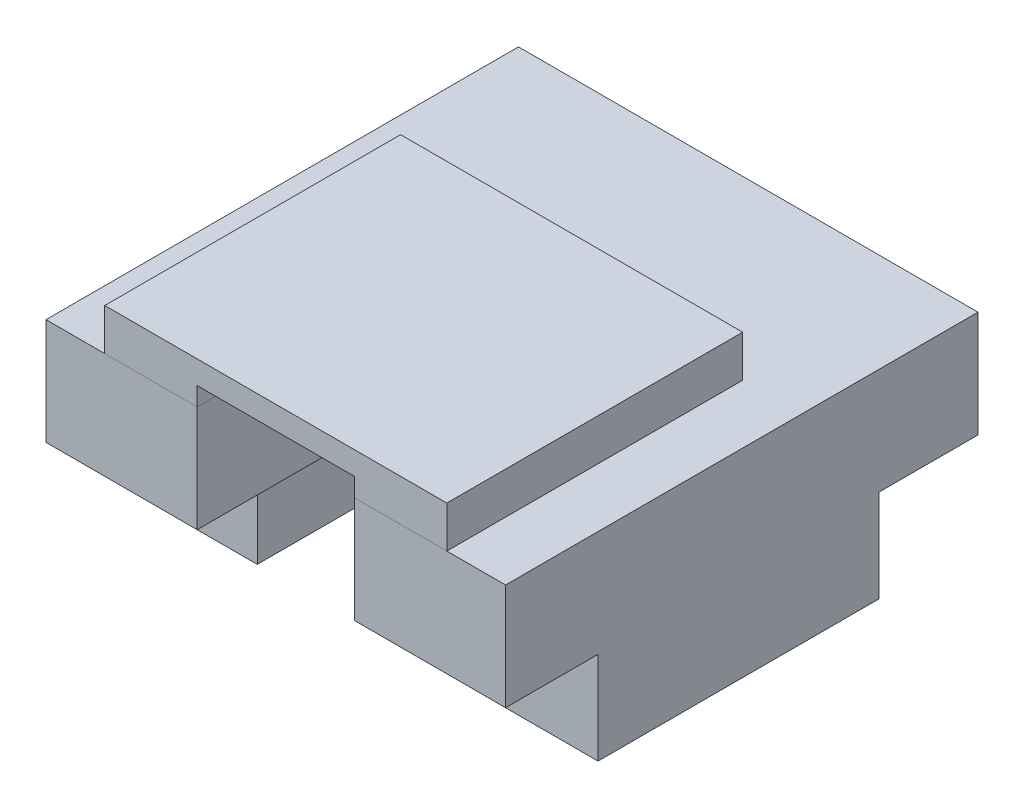
ISO-10303-21;
HEADER;
FILE_DESCRIPTION(('STEP AP214'),'2;1');
FILE_NAME('part.step','',(''),(''),'','','');
FILE_SCHEMA(('AUTOMOTIVE_DESIGN { 1 0 10303 214 1 1 1 1 }'));
ENDSEC;
DATA;
#1=APPLICATION_CONTEXT('core data for automotive mechanical design processes');
#2=APPLICATION_PROTOCOL_DEFINITION('international standard','automotive_design',2000,#1);
#3=PRODUCT_CONTEXT('',#1,'mechanical');
#4=PRODUCT('Part','Part','',(#3));
#5=PRODUCT_RELATED_PRODUCT_CATEGORY('part','',(#4));
#6=PRODUCT_DEFINITION_FORMATION('','',#4);
#7=PRODUCT_DEFINITION_CONTEXT('part definition',#1,'design');
#8=PRODUCT_DEFINITION('design','',#6,#7);
#9=PRODUCT_DEFINITION_SHAPE('','',#8);
#10=(LENGTH_UNIT() NAMED_UNIT(*) SI_UNIT(.MILLI.,.METRE.));
#11=(NAMED_UNIT(*) PLANE_ANGLE_UNIT() SI_UNIT($,.RADIAN.));
#12=(NAMED_UNIT(*) SI_UNIT($,.STERADIAN.) SOLID_ANGLE_UNIT());
#13=UNCERTAINTY_MEASURE_WITH_UNIT(LENGTH_MEASURE(1.E-05),#10,'distance_accuracy_value','');
#14=(GEOMETRIC_REPRESENTATION_CONTEXT(3) GLOBAL_UNCERTAINTY_ASSIGNED_CONTEXT((#13)) GLOBAL_UNIT_ASSIGNED_CONTEXT((#10,
#11,#12)) REPRESENTATION_CONTEXT('',''));
#15=CARTESIAN_POINT('',(0.,0.,0.));
#16=DIRECTION('',(0.,0.,1.));
#17=DIRECTION('',(1.,0.,0.));
#18=AXIS2_PLACEMENT_3D('',#15,#16,#17);
#19=CARTESIAN_POINT('',(9.25,6.75,0.));
#20=DIRECTION('',(-1.,0.,0.));
#21=DIRECTION('',(0.,0.,1.));
#22=AXIS2_PLACEMENT_3D('',#19,#20,#21);
#23=PLANE('',#22);
#24=DIRECTION('',(0.,0.,-1.));
#25=VECTOR('',#24,1.);
#26=CARTESIAN_POINT('',(9.25,5.75,0.));
#27=LINE('',#26,#25);
#28=CARTESIAN_POINT('',(9.25,5.75,12.6));
#29=VERTEX_POINT('',#28);
#30=CARTESIAN_POINT('',(9.25,5.75,-3.4));
#31=VERTEX_POINT('',#30);
#32=EDGE_CURVE('E173',#29,#31,#27,.T.);
#33=ORIENTED_EDGE('',*,*,#32,.T.);
#34=DIRECTION('',(0.,-1.,0.));
#35=VECTOR('',#34,1.);
#36=CARTESIAN_POINT('',(9.25,6.75,-3.4));
#37=LINE('',#36,#35);
#38=CARTESIAN_POINT('',(9.25,8.,-3.4));
#39=VERTEX_POINT('',#38);
#40=EDGE_CURVE('E66',#39,#31,#37,.T.);
#41=ORIENTED_EDGE('',*,*,#40,.F.);
#42=DIRECTION('',(0.,0.,-1.));
#43=VECTOR('',#42,1.);
#44=CARTESIAN_POINT('',(9.25,8.,-3.4));
#45=LINE('',#44,#43);
#46=CARTESIAN_POINT('',(9.25,8.,12.6));
#47=VERTEX_POINT('',#46);
#48=EDGE_CURVE('E149',#47,#39,#45,.T.);
#49=ORIENTED_EDGE('',*,*,#48,.F.);
#50=DIRECTION('',(0.,-1.,0.));
#51=VECTOR('',#50,1.);
#52=CARTESIAN_POINT('',(9.25,6.75,12.6));
#53=LINE('',#52,#51);
#54=EDGE_CURVE('E12',#47,#29,#53,.T.);
#55=ORIENTED_EDGE('',*,*,#54,.T.);
#56=EDGE_LOOP('',(#33,#41,#49,#55));
#57=FACE_BOUND('',#56,.T.);
#58=ADVANCED_FACE('F58',(#57),#23,.F.);
#59=CARTESIAN_POINT('',(0.,6.75,-3.4));
#60=DIRECTION('',(0.,0.,1.));
#61=DIRECTION('',(1.,0.,0.));
#62=AXIS2_PLACEMENT_3D('',#59,#60,#61);
#63=PLANE('',#62);
#64=DIRECTION('',(-1.,0.,0.));
#65=VECTOR('',#64,1.);
#66=CARTESIAN_POINT('',(0.,5.75,-3.4));
#67=LINE('',#66,#65);
#68=CARTESIAN_POINT('',(-9.25,5.75,-3.4));
#69=VERTEX_POINT('',#68);
#70=EDGE_CURVE('E175',#31,#69,#67,.T.);
#71=ORIENTED_EDGE('',*,*,#70,.T.);
#72=DIRECTION('',(0.,-1.,0.));
#73=VECTOR('',#72,1.);
#74=CARTESIAN_POINT('',(-9.25,6.75,-3.4));
#75=LINE('',#74,#73);
#76=CARTESIAN_POINT('',(-9.25,8.,-3.4));
#77=VERTEX_POINT('',#76);
#78=EDGE_CURVE('E140',#77,#69,#75,.T.);
#79=ORIENTED_EDGE('',*,*,#78,.F.);
#80=DIRECTION('',(-1.,0.,0.));
#81=VECTOR('',#80,1.);
#82=CARTESIAN_POINT('',(-9.25,8.,-3.4));
#83=LINE('',#82,#81);
#84=EDGE_CURVE('E154',#39,#77,#83,.T.);
#85=ORIENTED_EDGE('',*,*,#84,.F.);
#86=ORIENTED_EDGE('',*,*,#40,.T.);
#87=EDGE_LOOP('',(#71,#79,#85,#86));
#88=FACE_BOUND('',#87,.T.);
#89=ADVANCED_FACE('F192',(#88),#63,.F.);
#90=CARTESIAN_POINT('',(-9.25,6.75,0.));
#91=DIRECTION('',(1.,0.,0.));
#92=DIRECTION('',(0.,0.,-1.));
#93=AXIS2_PLACEMENT_3D('',#90,#91,#92);
#94=PLANE('',#93);
#95=DIRECTION('',(0.,0.,1.));
#96=VECTOR('',#95,1.);
#97=CARTESIAN_POINT('',(-9.25,5.75,0.));
#98=LINE('',#97,#96);
#99=CARTESIAN_POINT('',(-9.25,5.75,12.6));
#100=VERTEX_POINT('',#99);
#101=EDGE_CURVE('E138',#69,#100,#98,.T.);
#102=ORIENTED_EDGE('',*,*,#101,.T.);
#103=DIRECTION('',(0.,-1.,0.));
#104=VECTOR('',#103,1.);
#105=CARTESIAN_POINT('',(-9.25,6.75,12.6));
#106=LINE('',#105,#104);
#107=CARTESIAN_POINT('',(-9.25,8.,12.6));
#108=VERTEX_POINT('',#107);
#109=EDGE_CURVE('E131',#108,#100,#106,.T.);
#110=ORIENTED_EDGE('',*,*,#109,.F.);
#111=DIRECTION('',(0.,0.,1.));
#112=VECTOR('',#111,1.);
#113=CARTESIAN_POINT('',(-9.25,8.,-3.4));
#114=LINE('',#113,#112);
#115=EDGE_CURVE('E136',#77,#108,#114,.T.);
#116=ORIENTED_EDGE('',*,*,#115,.F.);
#117=ORIENTED_EDGE('',*,*,#78,.T.);
#118=EDGE_LOOP('',(#102,#110,#116,#117));
#119=FACE_BOUND('',#118,.T.);
#120=ADVANCED_FACE('F133',(#119),#94,.F.);
#121=CARTESIAN_POINT('',(0.,6.75,12.6));
#122=DIRECTION('',(0.,0.,-1.));
#123=DIRECTION('',(-1.,0.,0.));
#124=AXIS2_PLACEMENT_3D('',#121,#122,#123);
#125=PLANE('',#124);
#126=DIRECTION('',(1.,0.,0.));
#127=VECTOR('',#126,1.);
#128=CARTESIAN_POINT('',(0.,5.75,12.6));
#129=LINE('',#128,#127);
#130=CARTESIAN_POINT('',(-4.25,5.75,12.6));
#131=VERTEX_POINT('',#130);
#132=EDGE_CURVE('E178',#100,#131,#129,.T.);
#133=ORIENTED_EDGE('',*,*,#132,.T.);
#134=DIRECTION('',(0.,-1.,0.));
#135=VECTOR('',#134,1.);
#136=CARTESIAN_POINT('',(-4.25,6.75,12.6));
#137=LINE('',#136,#135);
#138=CARTESIAN_POINT('',(-4.25,6.75,12.6));
#139=VERTEX_POINT('',#138);
#140=EDGE_CURVE('E113',#139,#131,#137,.T.);
#141=ORIENTED_EDGE('',*,*,#140,.F.);
#142=DIRECTION('',(1.,0.,0.));
#143=VECTOR('',#142,1.);
#144=CARTESIAN_POINT('',(-9.25,6.75,12.6));
#145=LINE('',#144,#143);
#146=CARTESIAN_POINT('',(4.25,6.75,12.6));
#147=VERTEX_POINT('',#146);
#148=EDGE_CURVE('E155',#139,#147,#145,.T.);
#149=ORIENTED_EDGE('',*,*,#148,.T.);
#150=DIRECTION('',(0.,-1.,0.));
#151=VECTOR('',#150,1.);
#152=CARTESIAN_POINT('',(4.25,6.75,12.6));
#153=LINE('',#152,#151);
#154=CARTESIAN_POINT('',(4.25,5.75,12.6));
#155=VERTEX_POINT('',#154);
#156=EDGE_CURVE('E171',#147,#155,#153,.T.);
#157=ORIENTED_EDGE('',*,*,#156,.T.);
#158=DIRECTION('',(1.,0.,0.));
#159=VECTOR('',#158,1.);
#160=CARTESIAN_POINT('',(0.,5.75,12.6));
#161=LINE('',#160,#159);
#162=EDGE_CURVE('E160',#155,#29,#161,.T.);
#163=ORIENTED_EDGE('',*,*,#162,.T.);
#164=ORIENTED_EDGE('',*,*,#54,.F.);
#165=DIRECTION('',(1.,0.,0.));
#166=VECTOR('',#165,1.);
#167=CARTESIAN_POINT('',(-9.25,8.,12.6));
#168=LINE('',#167,#166);
#169=EDGE_CURVE('E143',#108,#47,#168,.T.);
#170=ORIENTED_EDGE('',*,*,#169,.F.);
#171=ORIENTED_EDGE('',*,*,#109,.T.);
#172=EDGE_LOOP('',(#133,#141,#149,#157,#163,#164,#170,#171));
#173=FACE_BOUND('',#172,.T.);
#174=ADVANCED_FACE('F144',(#173),#125,.F.);
#175=CARTESIAN_POINT('',(-4.25,6.75,0.));
#176=DIRECTION('',(-1.,0.,0.));
#177=DIRECTION('',(0.,0.,1.));
#178=AXIS2_PLACEMENT_3D('',#175,#176,#177);
#179=PLANE('',#178);
#180=DIRECTION('',(0.,0.,-1.));
#181=VECTOR('',#180,1.);
#182=CARTESIAN_POINT('',(-4.25,5.75,0.));
#183=LINE('',#182,#181);
#184=CARTESIAN_POINT('',(-4.25,5.75,1.6));
#185=VERTEX_POINT('',#184);
#186=EDGE_CURVE('E180',#131,#185,#183,.T.);
#187=ORIENTED_EDGE('',*,*,#186,.T.);
#188=DIRECTION('',(0.,-1.,0.));
#189=VECTOR('',#188,1.);
#190=CARTESIAN_POINT('',(-4.25,6.75,1.6));
#191=LINE('',#190,#189);
#192=CARTESIAN_POINT('',(-4.25,6.75,1.6));
#193=VERTEX_POINT('',#192);
#194=EDGE_CURVE('E186',#193,#185,#191,.T.);
#195=ORIENTED_EDGE('',*,*,#194,.F.);
#196=DIRECTION('',(0.,0.,-1.));
#197=VECTOR('',#196,1.);
#198=CARTESIAN_POINT('',(-4.25,6.75,0.));
#199=LINE('',#198,#197);
#200=EDGE_CURVE('E162',#139,#193,#199,.T.);
#201=ORIENTED_EDGE('',*,*,#200,.F.);
#202=ORIENTED_EDGE('',*,*,#140,.T.);
#203=EDGE_LOOP('',(#187,#195,#201,#202));
#204=FACE_BOUND('',#203,.T.);
#205=ADVANCED_FACE('F199',(#204),#179,.F.);
#206=CARTESIAN_POINT('',(0.,6.75,1.6));
#207=DIRECTION('',(0.,0.,-1.));
#208=DIRECTION('',(-1.,0.,0.));
#209=AXIS2_PLACEMENT_3D('',#206,#207,#208);
#210=PLANE('',#209);
#211=DIRECTION('',(1.,0.,0.));
#212=VECTOR('',#211,1.);
#213=CARTESIAN_POINT('',(0.,5.75,1.6));
#214=LINE('',#213,#212);
#215=CARTESIAN_POINT('',(4.25,5.75,1.6));
#216=VERTEX_POINT('',#215);
#217=EDGE_CURVE('E102',#185,#216,#214,.T.);
#218=ORIENTED_EDGE('',*,*,#217,.T.);
#219=DIRECTION('',(0.,-1.,0.));
#220=VECTOR('',#219,1.);
#221=CARTESIAN_POINT('',(4.25,6.75,1.6));
#222=LINE('',#221,#220);
#223=CARTESIAN_POINT('',(4.25,6.75,1.6));
#224=VERTEX_POINT('',#223);
#225=EDGE_CURVE('E74',#224,#216,#222,.T.);
#226=ORIENTED_EDGE('',*,*,#225,.F.);
#227=DIRECTION('',(1.,0.,0.));
#228=VECTOR('',#227,1.);
#229=CARTESIAN_POINT('',(0.,6.75,1.6));
#230=LINE('',#229,#228);
#231=EDGE_CURVE('E165',#193,#224,#230,.T.);
#232=ORIENTED_EDGE('',*,*,#231,.F.);
#233=ORIENTED_EDGE('',*,*,#194,.T.);
#234=EDGE_LOOP('',(#218,#226,#232,#233));
#235=FACE_BOUND('',#234,.T.);
#236=ADVANCED_FACE('F204',(#235),#210,.F.);
#237=CARTESIAN_POINT('',(4.25,6.75,0.));
#238=DIRECTION('',(1.,0.,0.));
#239=DIRECTION('',(0.,0.,-1.));
#240=AXIS2_PLACEMENT_3D('',#237,#238,#239);
#241=PLANE('',#240);
#242=DIRECTION('',(0.,0.,1.));
#243=VECTOR('',#242,1.);
#244=CARTESIAN_POINT('',(4.25,5.75,0.));
#245=LINE('',#244,#243);
#246=EDGE_CURVE('E107',#216,#155,#245,.T.);
#247=ORIENTED_EDGE('',*,*,#246,.T.);
#248=ORIENTED_EDGE('',*,*,#156,.F.);
#249=DIRECTION('',(0.,0.,1.));
#250=VECTOR('',#249,1.);
#251=CARTESIAN_POINT('',(4.25,6.75,0.));
#252=LINE('',#251,#250);
#253=EDGE_CURVE('E168',#224,#147,#252,.T.);
#254=ORIENTED_EDGE('',*,*,#253,.F.);
#255=ORIENTED_EDGE('',*,*,#225,.T.);
#256=EDGE_LOOP('',(#247,#248,#254,#255));
#257=FACE_BOUND('',#256,.T.);
#258=ADVANCED_FACE('F203',(#257),#241,.F.);
#259=CARTESIAN_POINT('',(0.,5.75,0.));
#260=DIRECTION('',(0.,1.,0.));
#261=DIRECTION('',(0.,0.,1.));
#262=AXIS2_PLACEMENT_3D('',#259,#260,#261);
#263=PLANE('',#262);
#264=ORIENTED_EDGE('',*,*,#162,.F.);
#265=ORIENTED_EDGE('',*,*,#246,.F.);
#266=ORIENTED_EDGE('',*,*,#217,.F.);
#267=ORIENTED_EDGE('',*,*,#186,.F.);
#268=ORIENTED_EDGE('',*,*,#132,.F.);
#269=ORIENTED_EDGE('',*,*,#101,.F.);
#270=ORIENTED_EDGE('',*,*,#70,.F.);
#271=ORIENTED_EDGE('',*,*,#32,.F.);
#272=EDGE_LOOP('',(#264,#265,#266,#267,#268,#269,#270,#271));
#273=FACE_BOUND('',#272,.T.);
#274=ADVANCED_FACE('F196',(#273),#263,.F.);
#275=CARTESIAN_POINT('',(0.,6.75,0.));
#276=DIRECTION('',(0.,1.,0.));
#277=DIRECTION('',(0.,0.,1.));
#278=AXIS2_PLACEMENT_3D('',#275,#276,#277);
#279=PLANE('',#278);
#280=ORIENTED_EDGE('',*,*,#148,.F.);
#281=ORIENTED_EDGE('',*,*,#200,.T.);
#282=ORIENTED_EDGE('',*,*,#231,.T.);
#283=ORIENTED_EDGE('',*,*,#253,.T.);
#284=EDGE_LOOP('',(#280,#281,#282,#283));
#285=FACE_BOUND('',#284,.T.);
#286=ADVANCED_FACE('F202',(#285),#279,.F.);
#287=CARTESIAN_POINT('',(0.,8.,0.));
#288=DIRECTION('',(0.,1.,0.));
#289=DIRECTION('',(0.,0.,1.));
#290=AXIS2_PLACEMENT_3D('',#287,#288,#289);
#291=PLANE('',#290);
#292=ORIENTED_EDGE('',*,*,#115,.T.);
#293=ORIENTED_EDGE('',*,*,#169,.T.);
#294=ORIENTED_EDGE('',*,*,#48,.T.);
#295=ORIENTED_EDGE('',*,*,#84,.T.);
#296=EDGE_LOOP('',(#292,#293,#294,#295));
#297=FACE_BOUND('',#296,.T.);
#298=ADVANCED_FACE('F152',(#297),#291,.T.);
#299=CLOSED_SHELL('',(#58,#89,#120,#174,#205,#236,#258,#274,#286,#298));
#300=MANIFOLD_SOLID_BREP('B2',#299);
#301=CARTESIAN_POINT('',(0.,0.,0.));
#302=DIRECTION('',(0.,1.,0.));
#303=DIRECTION('',(0.,0.,1.));
#304=AXIS2_PLACEMENT_3D('',#301,#302,#303);
#305=PLANE('',#304);
#306=DIRECTION('',(0.,0.,-1.));
#307=VECTOR('',#306,1.);
#308=CARTESIAN_POINT('',(-6.,0.,13.6933866224478));
#309=LINE('',#308,#307);
#310=CARTESIAN_POINT('',(-6.00000000000001,0.,-7.6));
#311=VERTEX_POINT('',#310);
#312=CARTESIAN_POINT('',(-6.00000000000001,0.,-12.95));
#313=VERTEX_POINT('',#312);
#314=EDGE_CURVE('E336',#311,#313,#309,.T.);
#315=ORIENTED_EDGE('',*,*,#314,.F.);
#316=DIRECTION('',(-1.,0.,0.));
#317=VECTOR('',#316,1.);
#318=CARTESIAN_POINT('',(12.425,0.,-7.6));
#319=LINE('',#318,#317);
#320=CARTESIAN_POINT('',(-12.425,0.,-7.6));
#321=VERTEX_POINT('',#320);
#322=EDGE_CURVE('E327',#311,#321,#319,.T.);
#323=ORIENTED_EDGE('',*,*,#322,.T.);
#324=DIRECTION('',(0.,0.,1.));
#325=VECTOR('',#324,1.);
#326=CARTESIAN_POINT('',(-12.425,0.,-12.95));
#327=LINE('',#326,#325);
#328=CARTESIAN_POINT('',(-12.425,0.,-12.95));
#329=VERTEX_POINT('',#328);
#330=EDGE_CURVE('E574',#329,#321,#327,.T.);
#331=ORIENTED_EDGE('',*,*,#330,.F.);
#332=DIRECTION('',(-1.,0.,0.));
#333=VECTOR('',#332,1.);
#334=CARTESIAN_POINT('',(12.425,0.,-12.95));
#335=LINE('',#334,#333);
#336=EDGE_CURVE('E562',#313,#329,#335,.T.);
#337=ORIENTED_EDGE('',*,*,#336,.F.);
#338=EDGE_LOOP('',(#315,#323,#331,#337));
#339=FACE_BOUND('',#338,.T.);
#340=ADVANCED_FACE('F317',(#339),#305,.F.);
#341=DIRECTION('',(1.,0.,0.));
#342=VECTOR('',#341,1.);
#343=CARTESIAN_POINT('',(0.,0.,1.1));
#344=LINE('',#343,#342);
#345=CARTESIAN_POINT('',(-6.00000000000001,0.,1.1));
#346=VERTEX_POINT('',#345);
#347=CARTESIAN_POINT('',(6.,0.,1.1));
#348=VERTEX_POINT('',#347);
#349=EDGE_CURVE('E747',#346,#348,#344,.T.);
#350=ORIENTED_EDGE('',*,*,#349,.T.);
#351=DIRECTION('',(0.,0.,-1.));
#352=VECTOR('',#351,1.);
#353=CARTESIAN_POINT('',(6.,0.,7.6));
#354=LINE('',#353,#352);
#355=CARTESIAN_POINT('',(6.,0.,7.6));
#356=VERTEX_POINT('',#355);
#357=EDGE_CURVE('E604',#356,#348,#354,.T.);
#358=ORIENTED_EDGE('',*,*,#357,.F.);
#359=DIRECTION('',(1.,0.,0.));
#360=VECTOR('',#359,1.);
#361=CARTESIAN_POINT('',(-12.425,0.,7.6));
#362=LINE('',#361,#360);
#363=CARTESIAN_POINT('',(12.425,0.,7.6));
#364=VERTEX_POINT('',#363);
#365=EDGE_CURVE('E56',#356,#364,#362,.T.);
#366=ORIENTED_EDGE('',*,*,#365,.T.);
#367=DIRECTION('',(0.,0.,-1.));
#368=VECTOR('',#367,1.);
#369=CARTESIAN_POINT('',(12.425,0.,12.6));
#370=LINE('',#369,#368);
#371=CARTESIAN_POINT('',(12.425,0.,12.6));
#372=VERTEX_POINT('',#371);
#373=EDGE_CURVE('E546',#372,#364,#370,.T.);
#374=ORIENTED_EDGE('',*,*,#373,.F.);
#375=DIRECTION('',(1.,0.,0.));
#376=VECTOR('',#375,1.);
#377=CARTESIAN_POINT('',(-12.425,0.,12.6));
#378=LINE('',#377,#376);
#379=CARTESIAN_POINT('',(4.25,0.,12.6));
#380=VERTEX_POINT('',#379);
#381=EDGE_CURVE('E533',#380,#372,#378,.T.);
#382=ORIENTED_EDGE('',*,*,#381,.F.);
#383=DIRECTION('',(0.,0.,1.));
#384=VECTOR('',#383,1.);
#385=CARTESIAN_POINT('',(4.25,0.,1.6));
#386=LINE('',#385,#384);
#387=CARTESIAN_POINT('',(4.25,0.,1.6));
#388=VERTEX_POINT('',#387);
#389=EDGE_CURVE('E500',#388,#380,#386,.T.);
#390=ORIENTED_EDGE('',*,*,#389,.F.);
#391=DIRECTION('',(1.,0.,0.));
#392=VECTOR('',#391,1.);
#393=CARTESIAN_POINT('',(-4.25,0.,1.6));
#394=LINE('',#393,#392);
#395=CARTESIAN_POINT('',(-4.25,0.,1.6));
#396=VERTEX_POINT('',#395);
#397=EDGE_CURVE('E504',#396,#388,#394,.T.);
#398=ORIENTED_EDGE('',*,*,#397,.F.);
#399=DIRECTION('',(0.,0.,-1.));
#400=VECTOR('',#399,1.);
#401=CARTESIAN_POINT('',(-4.25,0.,1.6));
#402=LINE('',#401,#400);
#403=CARTESIAN_POINT('',(-4.25,0.,12.6));
#404=VERTEX_POINT('',#403);
#405=EDGE_CURVE('E497',#404,#396,#402,.T.);
#406=ORIENTED_EDGE('',*,*,#405,.F.);
#407=CARTESIAN_POINT('',(-12.425,0.,12.6));
#408=VERTEX_POINT('',#407);
#409=EDGE_CURVE('E534',#408,#404,#378,.T.);
#410=ORIENTED_EDGE('',*,*,#409,.F.);
#411=DIRECTION('',(0.,0.,-1.));
#412=VECTOR('',#411,1.);
#413=CARTESIAN_POINT('',(-12.425,0.,12.6));
#414=LINE('',#413,#412);
#415=CARTESIAN_POINT('',(-12.425,0.,7.6));
#416=VERTEX_POINT('',#415);
#417=EDGE_CURVE('E553',#408,#416,#414,.T.);
#418=ORIENTED_EDGE('',*,*,#417,.T.);
#419=CARTESIAN_POINT('',(-6.,0.,7.6));
#420=VERTEX_POINT('',#419);
#421=EDGE_CURVE('E329',#416,#420,#362,.T.);
#422=ORIENTED_EDGE('',*,*,#421,.T.);
#423=DIRECTION('',(0.,0.,1.));
#424=VECTOR('',#423,1.);
#425=CARTESIAN_POINT('',(-6.,0.,7.6));
#426=LINE('',#425,#424);
#427=EDGE_CURVE('E591',#346,#420,#426,.T.);
#428=ORIENTED_EDGE('',*,*,#427,.F.);
#429=EDGE_LOOP('',(#350,#358,#366,#374,#382,#390,#398,#406,#410,#418,#422,#428));
#430=FACE_BOUND('',#429,.T.);
#431=ADVANCED_FACE('F687',(#430),#305,.F.);
#432=CARTESIAN_POINT('',(0.,0.,12.6));
#433=DIRECTION('',(0.,0.,1.));
#434=DIRECTION('',(1.,0.,0.));
#435=AXIS2_PLACEMENT_3D('',#432,#433,#434);
#436=PLANE('',#435);
#437=DIRECTION('',(0.,1.,0.));
#438=VECTOR('',#437,1.);
#439=CARTESIAN_POINT('',(4.25,-13.9014387744578,12.6));
#440=LINE('',#439,#438);
#441=CARTESIAN_POINT('',(4.25,5.75,12.6));
#442=VERTEX_POINT('',#441);
#443=EDGE_CURVE('E501',#380,#442,#440,.T.);
#444=ORIENTED_EDGE('',*,*,#443,.F.);
#445=ORIENTED_EDGE('',*,*,#381,.T.);
#446=DIRECTION('',(0.,1.,0.));
#447=VECTOR('',#446,1.);
#448=CARTESIAN_POINT('',(12.425,5.75,12.6));
#449=LINE('',#448,#447);
#450=CARTESIAN_POINT('',(12.425,5.75,12.6));
#451=VERTEX_POINT('',#450);
#452=EDGE_CURVE('E538',#372,#451,#449,.T.);
#453=ORIENTED_EDGE('',*,*,#452,.T.);
#454=DIRECTION('',(-1.,0.,0.));
#455=VECTOR('',#454,1.);
#456=CARTESIAN_POINT('',(-12.425,5.75,12.6));
#457=LINE('',#456,#455);
#458=EDGE_CURVE('E543',#451,#442,#457,.T.);
#459=ORIENTED_EDGE('',*,*,#458,.T.);
#460=EDGE_LOOP('',(#444,#445,#453,#459));
#461=FACE_BOUND('',#460,.T.);
#462=ADVANCED_FACE('F680',(#461),#436,.T.);
#463=CARTESIAN_POINT('',(12.425,5.75,7.6));
#464=DIRECTION('',(0.,0.,-1.));
#465=DIRECTION('',(-1.,0.,0.));
#466=AXIS2_PLACEMENT_3D('',#463,#464,#465);
#467=PLANE('',#466);
#468=ORIENTED_EDGE('',*,*,#421,.F.);
#469=DIRECTION('',(0.,-1.,0.));
#470=VECTOR('',#469,1.);
#471=CARTESIAN_POINT('',(-12.425,5.75,7.6));
#472=LINE('',#471,#470);
#473=CARTESIAN_POINT('',(-12.425,-5.,7.6));
#474=VERTEX_POINT('',#473);
#475=EDGE_CURVE('E321',#416,#474,#472,.T.);
#476=ORIENTED_EDGE('',*,*,#475,.T.);
#477=DIRECTION('',(-1.,0.,0.));
#478=VECTOR('',#477,1.);
#479=CARTESIAN_POINT('',(-12.425,-5.,7.6));
#480=LINE('',#479,#478);
#481=CARTESIAN_POINT('',(-6.,-5.,7.6));
#482=VERTEX_POINT('',#481);
#483=EDGE_CURVE('E597',#482,#474,#480,.T.);
#484=ORIENTED_EDGE('',*,*,#483,.F.);
#485=DIRECTION('',(0.,1.,0.));
#486=VECTOR('',#485,1.);
#487=CARTESIAN_POINT('',(-6.,-5.,7.6));
#488=LINE('',#487,#486);
#489=EDGE_CURVE('E601',#482,#420,#488,.T.);
#490=ORIENTED_EDGE('',*,*,#489,.T.);
#491=EDGE_LOOP('',(#468,#476,#484,#490));
#492=FACE_BOUND('',#491,.T.);
#493=ADVANCED_FACE('F712',(#492),#467,.F.);
#494=ORIENTED_EDGE('',*,*,#365,.F.);
#495=DIRECTION('',(0.,1.,0.));
#496=VECTOR('',#495,1.);
#497=CARTESIAN_POINT('',(6.,-5.,7.6));
#498=LINE('',#497,#496);
#499=CARTESIAN_POINT('',(6.,-5.,7.6));
#500=VERTEX_POINT('',#499);
#501=EDGE_CURVE('E585',#500,#356,#498,.T.);
#502=ORIENTED_EDGE('',*,*,#501,.F.);
#503=DIRECTION('',(-1.,0.,0.));
#504=VECTOR('',#503,1.);
#505=CARTESIAN_POINT('',(12.425,-5.,7.6));
#506=LINE('',#505,#504);
#507=CARTESIAN_POINT('',(12.425,-5.,7.6));
#508=VERTEX_POINT('',#507);
#509=EDGE_CURVE('E630',#508,#500,#506,.T.);
#510=ORIENTED_EDGE('',*,*,#509,.F.);
#511=DIRECTION('',(0.,-1.,0.));
#512=VECTOR('',#511,1.);
#513=CARTESIAN_POINT('',(12.425,5.75,7.6));
#514=LINE('',#513,#512);
#515=EDGE_CURVE('E647',#364,#508,#514,.T.);
#516=ORIENTED_EDGE('',*,*,#515,.F.);
#517=EDGE_LOOP('',(#494,#502,#510,#516));
#518=FACE_BOUND('',#517,.T.);
#519=ADVANCED_FACE('F691',(#518),#467,.F.);
#520=CARTESIAN_POINT('',(12.425,5.75,-7.6));
#521=DIRECTION('',(0.,0.,1.));
#522=DIRECTION('',(1.,0.,0.));
#523=AXIS2_PLACEMENT_3D('',#520,#521,#522);
#524=PLANE('',#523);
#525=CARTESIAN_POINT('',(12.425,0.,-7.6));
#526=VERTEX_POINT('',#525);
#527=CARTESIAN_POINT('',(6.,0.,-7.6));
#528=VERTEX_POINT('',#527);
#529=EDGE_CURVE('E557',#526,#528,#319,.T.);
#530=ORIENTED_EDGE('',*,*,#529,.F.);
#531=DIRECTION('',(0.,-1.,0.));
#532=VECTOR('',#531,1.);
#533=CARTESIAN_POINT('',(12.425,5.75,-7.6));
#534=LINE('',#533,#532);
#535=CARTESIAN_POINT('',(12.425,-5.,-7.6));
#536=VERTEX_POINT('',#535);
#537=EDGE_CURVE('E645',#526,#536,#534,.T.);
#538=ORIENTED_EDGE('',*,*,#537,.T.);
#539=DIRECTION('',(1.,0.,0.));
#540=VECTOR('',#539,1.);
#541=CARTESIAN_POINT('',(12.425,-5.,-7.6));
#542=LINE('',#541,#540);
#543=CARTESIAN_POINT('',(6.,-5.,-7.6));
#544=VERTEX_POINT('',#543);
#545=EDGE_CURVE('E619',#544,#536,#542,.T.);
#546=ORIENTED_EDGE('',*,*,#545,.F.);
#547=DIRECTION('',(0.,1.,0.));
#548=VECTOR('',#547,1.);
#549=CARTESIAN_POINT('',(6.,-5.,-7.6));
#550=LINE('',#549,#548);
#551=EDGE_CURVE('E615',#544,#528,#550,.T.);
#552=ORIENTED_EDGE('',*,*,#551,.T.);
#553=EDGE_LOOP('',(#530,#538,#546,#552));
#554=FACE_BOUND('',#553,.T.);
#555=ADVANCED_FACE('F703',(#554),#524,.F.);
#556=ORIENTED_EDGE('',*,*,#322,.F.);
#557=DIRECTION('',(0.,1.,0.));
#558=VECTOR('',#557,1.);
#559=CARTESIAN_POINT('',(-6.,-5.,-7.6));
#560=LINE('',#559,#558);
#561=CARTESIAN_POINT('',(-6.,-5.,-7.6));
#562=VERTEX_POINT('',#561);
#563=EDGE_CURVE('E608',#562,#311,#560,.T.);
#564=ORIENTED_EDGE('',*,*,#563,.F.);
#565=DIRECTION('',(1.,0.,0.));
#566=VECTOR('',#565,1.);
#567=CARTESIAN_POINT('',(-12.425,-5.,-7.6));
#568=LINE('',#567,#566);
#569=CARTESIAN_POINT('',(-12.425,-5.,-7.6));
#570=VERTEX_POINT('',#569);
#571=EDGE_CURVE('E590',#570,#562,#568,.T.);
#572=ORIENTED_EDGE('',*,*,#571,.F.);
#573=DIRECTION('',(0.,-1.,0.));
#574=VECTOR('',#573,1.);
#575=CARTESIAN_POINT('',(-12.425,5.75,-7.6));
#576=LINE('',#575,#574);
#577=EDGE_CURVE('E642',#321,#570,#576,.T.);
#578=ORIENTED_EDGE('',*,*,#577,.F.);
#579=EDGE_LOOP('',(#556,#564,#572,#578));
#580=FACE_BOUND('',#579,.T.);
#581=ADVANCED_FACE('F705',(#580),#524,.F.);
#582=ORIENTED_EDGE('',*,*,#529,.T.);
#583=DIRECTION('',(0.,0.,-1.));
#584=VECTOR('',#583,1.);
#585=CARTESIAN_POINT('',(6.,0.,13.6933866224478));
#586=LINE('',#585,#584);
#587=CARTESIAN_POINT('',(5.99999999999999,0.,-12.95));
#588=VERTEX_POINT('',#587);
#589=EDGE_CURVE('E488',#528,#588,#586,.T.);
#590=ORIENTED_EDGE('',*,*,#589,.T.);
#591=CARTESIAN_POINT('',(12.425,0.,-12.95));
#592=VERTEX_POINT('',#591);
#593=EDGE_CURVE('E563',#592,#588,#335,.T.);
#594=ORIENTED_EDGE('',*,*,#593,.F.);
#595=DIRECTION('',(0.,0.,1.));
#596=VECTOR('',#595,1.);
#597=CARTESIAN_POINT('',(12.425,0.,-12.95));
#598=LINE('',#597,#596);
#599=EDGE_CURVE('E581',#592,#526,#598,.T.);
#600=ORIENTED_EDGE('',*,*,#599,.T.);
#601=EDGE_LOOP('',(#582,#590,#594,#600));
#602=FACE_BOUND('',#601,.T.);
#603=ADVANCED_FACE('F699',(#602),#305,.F.);
#604=CARTESIAN_POINT('',(-12.425,5.75,7.6));
#605=DIRECTION('',(1.,0.,0.));
#606=DIRECTION('',(0.,0.,-1.));
#607=AXIS2_PLACEMENT_3D('',#604,#605,#606);
#608=PLANE('',#607);
#609=DIRECTION('',(0.,0.,1.));
#610=VECTOR('',#609,1.);
#611=CARTESIAN_POINT('',(-12.425,5.75,7.6));
#612=LINE('',#611,#610);
#613=CARTESIAN_POINT('',(-12.425,5.75,-12.95));
#614=VERTEX_POINT('',#613);
#615=CARTESIAN_POINT('',(-12.425,5.75,12.6));
#616=VERTEX_POINT('',#615);
#617=EDGE_CURVE('E611',#614,#616,#612,.T.);
#618=ORIENTED_EDGE('',*,*,#617,.F.);
#619=DIRECTION('',(0.,1.,0.));
#620=VECTOR('',#619,1.);
#621=CARTESIAN_POINT('',(-12.425,5.75,-12.95));
#622=LINE('',#621,#620);
#623=EDGE_CURVE('E566',#329,#614,#622,.T.);
#624=ORIENTED_EDGE('',*,*,#623,.F.);
#625=ORIENTED_EDGE('',*,*,#330,.T.);
#626=ORIENTED_EDGE('',*,*,#577,.T.);
#627=DIRECTION('',(0.,0.,-1.));
#628=VECTOR('',#627,1.);
#629=CARTESIAN_POINT('',(-12.425,-5.,7.6));
#630=LINE('',#629,#628);
#631=EDGE_CURVE('E586',#474,#570,#630,.T.);
#632=ORIENTED_EDGE('',*,*,#631,.F.);
#633=ORIENTED_EDGE('',*,*,#475,.F.);
#634=ORIENTED_EDGE('',*,*,#417,.F.);
#635=DIRECTION('',(0.,-1.,0.));
#636=VECTOR('',#635,1.);
#637=CARTESIAN_POINT('',(-12.425,5.75,12.6));
#638=LINE('',#637,#636);
#639=EDGE_CURVE('E529',#616,#408,#638,.T.);
#640=ORIENTED_EDGE('',*,*,#639,.F.);
#641=EDGE_LOOP('',(#618,#624,#625,#626,#632,#633,#634,#640));
#642=FACE_BOUND('',#641,.T.);
#643=ADVANCED_FACE('F319',(#642),#608,.F.);
#644=CARTESIAN_POINT('',(12.425,5.75,7.6));
#645=DIRECTION('',(-1.,0.,0.));
#646=DIRECTION('',(0.,0.,1.));
#647=AXIS2_PLACEMENT_3D('',#644,#645,#646);
#648=PLANE('',#647);
#649=DIRECTION('',(0.,0.,-1.));
#650=VECTOR('',#649,1.);
#651=CARTESIAN_POINT('',(12.425,5.75,7.6));
#652=LINE('',#651,#650);
#653=CARTESIAN_POINT('',(12.425,5.75,-12.95));
#654=VERTEX_POINT('',#653);
#655=EDGE_CURVE('E639',#451,#654,#652,.T.);
#656=ORIENTED_EDGE('',*,*,#655,.F.);
#657=ORIENTED_EDGE('',*,*,#452,.F.);
#658=ORIENTED_EDGE('',*,*,#373,.T.);
#659=ORIENTED_EDGE('',*,*,#515,.T.);
#660=DIRECTION('',(0.,0.,1.));
#661=VECTOR('',#660,1.);
#662=CARTESIAN_POINT('',(12.425,-5.,7.6));
#663=LINE('',#662,#661);
#664=EDGE_CURVE('E623',#536,#508,#663,.T.);
#665=ORIENTED_EDGE('',*,*,#664,.F.);
#666=ORIENTED_EDGE('',*,*,#537,.F.);
#667=ORIENTED_EDGE('',*,*,#599,.F.);
#668=DIRECTION('',(0.,-1.,0.));
#669=VECTOR('',#668,1.);
#670=CARTESIAN_POINT('',(12.425,5.75,-12.95));
#671=LINE('',#670,#669);
#672=EDGE_CURVE('E558',#654,#592,#671,.T.);
#673=ORIENTED_EDGE('',*,*,#672,.F.);
#674=EDGE_LOOP('',(#656,#657,#658,#659,#665,#666,#667,#673));
#675=FACE_BOUND('',#674,.T.);
#676=ADVANCED_FACE('F676',(#675),#648,.F.);
#677=CARTESIAN_POINT('',(0.,5.75,0.));
#678=DIRECTION('',(0.,1.,0.));
#679=DIRECTION('',(0.,0.,1.));
#680=AXIS2_PLACEMENT_3D('',#677,#678,#679);
#681=PLANE('',#680);
#682=DIRECTION('',(0.,0.,-1.));
#683=VECTOR('',#682,1.);
#684=CARTESIAN_POINT('',(4.25,5.75,1.6));
#685=LINE('',#684,#683);
#686=CARTESIAN_POINT('',(4.25,5.75,1.6));
#687=VERTEX_POINT('',#686);
#688=EDGE_CURVE('E505',#442,#687,#685,.T.);
#689=ORIENTED_EDGE('',*,*,#688,.F.);
#690=ORIENTED_EDGE('',*,*,#458,.F.);
#691=ORIENTED_EDGE('',*,*,#655,.T.);
#692=DIRECTION('',(1.,0.,0.));
#693=VECTOR('',#692,1.);
#694=CARTESIAN_POINT('',(12.425,5.75,-12.95));
#695=LINE('',#694,#693);
#696=EDGE_CURVE('E570',#614,#654,#695,.T.);
#697=ORIENTED_EDGE('',*,*,#696,.F.);
#698=ORIENTED_EDGE('',*,*,#617,.T.);
#699=CARTESIAN_POINT('',(-4.25,5.75,12.6));
#700=VERTEX_POINT('',#699);
#701=EDGE_CURVE('E542',#700,#616,#457,.T.);
#702=ORIENTED_EDGE('',*,*,#701,.F.);
#703=DIRECTION('',(0.,0.,1.));
#704=VECTOR('',#703,1.);
#705=CARTESIAN_POINT('',(-4.25,5.75,1.6));
#706=LINE('',#705,#704);
#707=CARTESIAN_POINT('',(-4.25,5.75,1.6));
#708=VERTEX_POINT('',#707);
#709=EDGE_CURVE('E344',#708,#700,#706,.T.);
#710=ORIENTED_EDGE('',*,*,#709,.F.);
#711=DIRECTION('',(-1.,0.,0.));
#712=VECTOR('',#711,1.);
#713=CARTESIAN_POINT('',(-4.25,5.75,1.6));
#714=LINE('',#713,#712);
#715=EDGE_CURVE('E509',#687,#708,#714,.T.);
#716=ORIENTED_EDGE('',*,*,#715,.F.);
#717=EDGE_LOOP('',(#689,#690,#691,#697,#698,#702,#710,#716));
#718=FACE_BOUND('',#717,.T.);
#719=ADVANCED_FACE('F672',(#718),#681,.T.);
#720=CARTESIAN_POINT('',(6.,-5.,7.6));
#721=DIRECTION('',(1.,0.,0.));
#722=DIRECTION('',(0.,0.,-1.));
#723=AXIS2_PLACEMENT_3D('',#720,#721,#722);
#724=PLANE('',#723);
#725=ORIENTED_EDGE('',*,*,#357,.T.);
#726=DIRECTION('',(0.,1.,0.));
#727=VECTOR('',#726,1.);
#728=CARTESIAN_POINT('',(6.,0.,1.1));
#729=LINE('',#728,#727);
#730=CARTESIAN_POINT('',(6.,1.5,1.1));
#731=VERTEX_POINT('',#730);
#732=EDGE_CURVE('E496',#348,#731,#729,.T.);
#733=ORIENTED_EDGE('',*,*,#732,.T.);
#734=DIRECTION('',(0.,0.,-1.));
#735=VECTOR('',#734,1.);
#736=CARTESIAN_POINT('',(6.,1.5,13.6933866224478));
#737=LINE('',#736,#735);
#738=CARTESIAN_POINT('',(5.99999999999999,1.5,-12.95));
#739=VERTEX_POINT('',#738);
#740=EDGE_CURVE('E469',#731,#739,#737,.T.);
#741=ORIENTED_EDGE('',*,*,#740,.T.);
#742=DIRECTION('',(0.,-1.,0.));
#743=VECTOR('',#742,1.);
#744=CARTESIAN_POINT('',(5.99999999999999,0.,-12.95));
#745=LINE('',#744,#743);
#746=EDGE_CURVE('E470',#739,#588,#745,.T.);
#747=ORIENTED_EDGE('',*,*,#746,.T.);
#748=ORIENTED_EDGE('',*,*,#589,.F.);
#749=ORIENTED_EDGE('',*,*,#551,.F.);
#750=DIRECTION('',(0.,0.,-1.));
#751=VECTOR('',#750,1.);
#752=CARTESIAN_POINT('',(6.,-5.,7.6));
#753=LINE('',#752,#751);
#754=EDGE_CURVE('E627',#500,#544,#753,.T.);
#755=ORIENTED_EDGE('',*,*,#754,.F.);
#756=ORIENTED_EDGE('',*,*,#501,.T.);
#757=EDGE_LOOP('',(#725,#733,#741,#747,#748,#749,#755,#756));
#758=FACE_BOUND('',#757,.T.);
#759=ADVANCED_FACE('F702',(#758),#724,.F.);
#760=CARTESIAN_POINT('',(0.,-5.,0.));
#761=DIRECTION('',(0.,1.,0.));
#762=DIRECTION('',(0.,0.,1.));
#763=AXIS2_PLACEMENT_3D('',#760,#761,#762);
#764=PLANE('',#763);
#765=ORIENTED_EDGE('',*,*,#664,.T.);
#766=ORIENTED_EDGE('',*,*,#509,.T.);
#767=ORIENTED_EDGE('',*,*,#754,.T.);
#768=ORIENTED_EDGE('',*,*,#545,.T.);
#769=EDGE_LOOP('',(#765,#766,#767,#768));
#770=FACE_BOUND('',#769,.T.);
#771=ADVANCED_FACE('F694',(#770),#764,.F.);
#772=CARTESIAN_POINT('',(-6.,-5.,7.6));
#773=DIRECTION('',(-1.,0.,0.));
#774=DIRECTION('',(0.,0.,1.));
#775=AXIS2_PLACEMENT_3D('',#772,#773,#774);
#776=PLANE('',#775);
#777=ORIENTED_EDGE('',*,*,#563,.T.);
#778=ORIENTED_EDGE('',*,*,#314,.T.);
#779=DIRECTION('',(0.,-1.,0.));
#780=VECTOR('',#779,1.);
#781=CARTESIAN_POINT('',(-6.00000000000001,0.,-12.95));
#782=LINE('',#781,#780);
#783=CARTESIAN_POINT('',(-6.00000000000001,1.5,-12.95));
#784=VERTEX_POINT('',#783);
#785=EDGE_CURVE('E472',#784,#313,#782,.T.);
#786=ORIENTED_EDGE('',*,*,#785,.F.);
#787=DIRECTION('',(0.,0.,-1.));
#788=VECTOR('',#787,1.);
#789=CARTESIAN_POINT('',(-6.,1.5,13.6933866224478));
#790=LINE('',#789,#788);
#791=CARTESIAN_POINT('',(-6.00000000000001,1.5,1.1));
#792=VERTEX_POINT('',#791);
#793=EDGE_CURVE('E459',#792,#784,#790,.T.);
#794=ORIENTED_EDGE('',*,*,#793,.F.);
#795=DIRECTION('',(0.,1.,0.));
#796=VECTOR('',#795,1.);
#797=CARTESIAN_POINT('',(-6.,0.,1.1));
#798=LINE('',#797,#796);
#799=EDGE_CURVE('E510',#346,#792,#798,.T.);
#800=ORIENTED_EDGE('',*,*,#799,.F.);
#801=ORIENTED_EDGE('',*,*,#427,.T.);
#802=ORIENTED_EDGE('',*,*,#489,.F.);
#803=DIRECTION('',(0.,0.,1.));
#804=VECTOR('',#803,1.);
#805=CARTESIAN_POINT('',(-6.,-5.,7.6));
#806=LINE('',#805,#804);
#807=EDGE_CURVE('E594',#562,#482,#806,.T.);
#808=ORIENTED_EDGE('',*,*,#807,.F.);
#809=EDGE_LOOP('',(#777,#778,#786,#794,#800,#801,#802,#808));
#810=FACE_BOUND('',#809,.T.);
#811=ADVANCED_FACE('F473',(#810),#776,.F.);
#812=CARTESIAN_POINT('',(0.,-5.,0.));
#813=DIRECTION('',(0.,-1.,0.));
#814=DIRECTION('',(0.,0.,-1.));
#815=AXIS2_PLACEMENT_3D('',#812,#813,#814);
#816=PLANE('',#815);
#817=ORIENTED_EDGE('',*,*,#631,.T.);
#818=ORIENTED_EDGE('',*,*,#571,.T.);
#819=ORIENTED_EDGE('',*,*,#807,.T.);
#820=ORIENTED_EDGE('',*,*,#483,.T.);
#821=EDGE_LOOP('',(#817,#818,#819,#820));
#822=FACE_BOUND('',#821,.T.);
#823=ADVANCED_FACE('F756',(#822),#816,.T.);
#824=CARTESIAN_POINT('',(0.,0.,-12.95));
#825=DIRECTION('',(0.,0.,-1.));
#826=DIRECTION('',(-1.,0.,0.));
#827=AXIS2_PLACEMENT_3D('',#824,#825,#826);
#828=PLANE('',#827);
#829=ORIENTED_EDGE('',*,*,#746,.F.);
#830=DIRECTION('',(-1.,0.,0.));
#831=VECTOR('',#830,1.);
#832=CARTESIAN_POINT('',(0.,1.5,-12.95));
#833=LINE('',#832,#831);
#834=EDGE_CURVE('E463',#739,#784,#833,.T.);
#835=ORIENTED_EDGE('',*,*,#834,.T.);
#836=ORIENTED_EDGE('',*,*,#785,.T.);
#837=ORIENTED_EDGE('',*,*,#336,.T.);
#838=ORIENTED_EDGE('',*,*,#623,.T.);
#839=ORIENTED_EDGE('',*,*,#696,.T.);
#840=ORIENTED_EDGE('',*,*,#672,.T.);
#841=ORIENTED_EDGE('',*,*,#593,.T.);
#842=EDGE_LOOP('',(#829,#835,#836,#837,#838,#839,#840,#841));
#843=FACE_BOUND('',#842,.T.);
#844=ADVANCED_FACE('F478',(#843),#828,.T.);
#845=DIRECTION('',(0.,1.,0.));
#846=VECTOR('',#845,1.);
#847=CARTESIAN_POINT('',(-4.25,-13.9014387744578,12.6));
#848=LINE('',#847,#846);
#849=EDGE_CURVE('E519',#404,#700,#848,.T.);
#850=ORIENTED_EDGE('',*,*,#849,.T.);
#851=ORIENTED_EDGE('',*,*,#701,.T.);
#852=ORIENTED_EDGE('',*,*,#639,.T.);
#853=ORIENTED_EDGE('',*,*,#409,.T.);
#854=EDGE_LOOP('',(#850,#851,#852,#853));
#855=FACE_BOUND('',#854,.T.);
#856=ADVANCED_FACE('F737',(#855),#436,.T.);
#857=CARTESIAN_POINT('',(4.25,-13.9014387744578,1.6));
#858=DIRECTION('',(1.,0.,0.));
#859=DIRECTION('',(0.,0.,-1.));
#860=AXIS2_PLACEMENT_3D('',#857,#858,#859);
#861=PLANE('',#860);
#862=ORIENTED_EDGE('',*,*,#389,.T.);
#863=ORIENTED_EDGE('',*,*,#443,.T.);
#864=ORIENTED_EDGE('',*,*,#688,.T.);
#865=DIRECTION('',(0.,1.,0.));
#866=VECTOR('',#865,1.);
#867=CARTESIAN_POINT('',(4.25,-13.9014387744578,1.6));
#868=LINE('',#867,#866);
#869=EDGE_CURVE('E516',#388,#687,#868,.T.);
#870=ORIENTED_EDGE('',*,*,#869,.F.);
#871=EDGE_LOOP('',(#862,#863,#864,#870));
#872=FACE_BOUND('',#871,.T.);
#873=ADVANCED_FACE('F882',(#872),#861,.F.);
#874=CARTESIAN_POINT('',(-4.25,-13.9014387744578,1.6));
#875=DIRECTION('',(-1.,0.,0.));
#876=DIRECTION('',(0.,0.,1.));
#877=AXIS2_PLACEMENT_3D('',#874,#875,#876);
#878=PLANE('',#877);
#879=ORIENTED_EDGE('',*,*,#405,.T.);
#880=DIRECTION('',(0.,1.,0.));
#881=VECTOR('',#880,1.);
#882=CARTESIAN_POINT('',(-4.25,-13.9014387744578,1.6));
#883=LINE('',#882,#881);
#884=EDGE_CURVE('E522',#396,#708,#883,.T.);
#885=ORIENTED_EDGE('',*,*,#884,.T.);
#886=ORIENTED_EDGE('',*,*,#709,.T.);
#887=ORIENTED_EDGE('',*,*,#849,.F.);
#888=EDGE_LOOP('',(#879,#885,#886,#887));
#889=FACE_BOUND('',#888,.T.);
#890=ADVANCED_FACE('F895',(#889),#878,.F.);
#891=CARTESIAN_POINT('',(-4.25,-13.9014387744578,1.6));
#892=DIRECTION('',(0.,0.,-1.));
#893=DIRECTION('',(-1.,0.,0.));
#894=AXIS2_PLACEMENT_3D('',#891,#892,#893);
#895=PLANE('',#894);
#896=ORIENTED_EDGE('',*,*,#397,.T.);
#897=ORIENTED_EDGE('',*,*,#869,.T.);
#898=ORIENTED_EDGE('',*,*,#715,.T.);
#899=ORIENTED_EDGE('',*,*,#884,.F.);
#900=EDGE_LOOP('',(#896,#897,#898,#899));
#901=FACE_BOUND('',#900,.T.);
#902=ADVANCED_FACE('F904',(#901),#895,.F.);
#903=CARTESIAN_POINT('',(0.,1.5,13.6933866224478));
#904=DIRECTION('',(0.,-1.,0.));
#905=DIRECTION('',(0.,0.,-1.));
#906=AXIS2_PLACEMENT_3D('',#903,#904,#905);
#907=PLANE('',#906);
#908=ORIENTED_EDGE('',*,*,#793,.T.);
#909=ORIENTED_EDGE('',*,*,#834,.F.);
#910=ORIENTED_EDGE('',*,*,#740,.F.);
#911=DIRECTION('',(1.,0.,0.));
#912=VECTOR('',#911,1.);
#913=CARTESIAN_POINT('',(0.,1.5,1.1));
#914=LINE('',#913,#912);
#915=EDGE_CURVE('E466',#792,#731,#914,.T.);
#916=ORIENTED_EDGE('',*,*,#915,.F.);
#917=EDGE_LOOP('',(#908,#909,#910,#916));
#918=FACE_BOUND('',#917,.T.);
#919=ADVANCED_FACE('F460',(#918),#907,.T.);
#920=CARTESIAN_POINT('',(-4.25,-13.9014387744578,1.1));
#921=DIRECTION('',(0.,0.,-1.));
#922=DIRECTION('',(-1.,0.,0.));
#923=AXIS2_PLACEMENT_3D('',#920,#921,#922);
#924=PLANE('',#923);
#925=ORIENTED_EDGE('',*,*,#349,.F.);
#926=ORIENTED_EDGE('',*,*,#799,.T.);
#927=ORIENTED_EDGE('',*,*,#915,.T.);
#928=ORIENTED_EDGE('',*,*,#732,.F.);
#929=EDGE_LOOP('',(#925,#926,#927,#928));
#930=FACE_BOUND('',#929,.T.);
#931=ADVANCED_FACE('F753',(#930),#924,.T.);
#932=CLOSED_SHELL('',(#340,#431,#462,#493,#519,#555,#581,#603,#643,#676,#719,#759,#771,#811,
#823,#844,#856,#873,#890,#902,#919,#931));
#933=MANIFOLD_SOLID_BREP('B6',#932);
#934=ADVANCED_BREP_SHAPE_REPRESENTATION('',(#18,#300,#933),#14);
#935=SHAPE_DEFINITION_REPRESENTATION(#9,#934);
ENDSEC;
END-ISO-10303-21;
